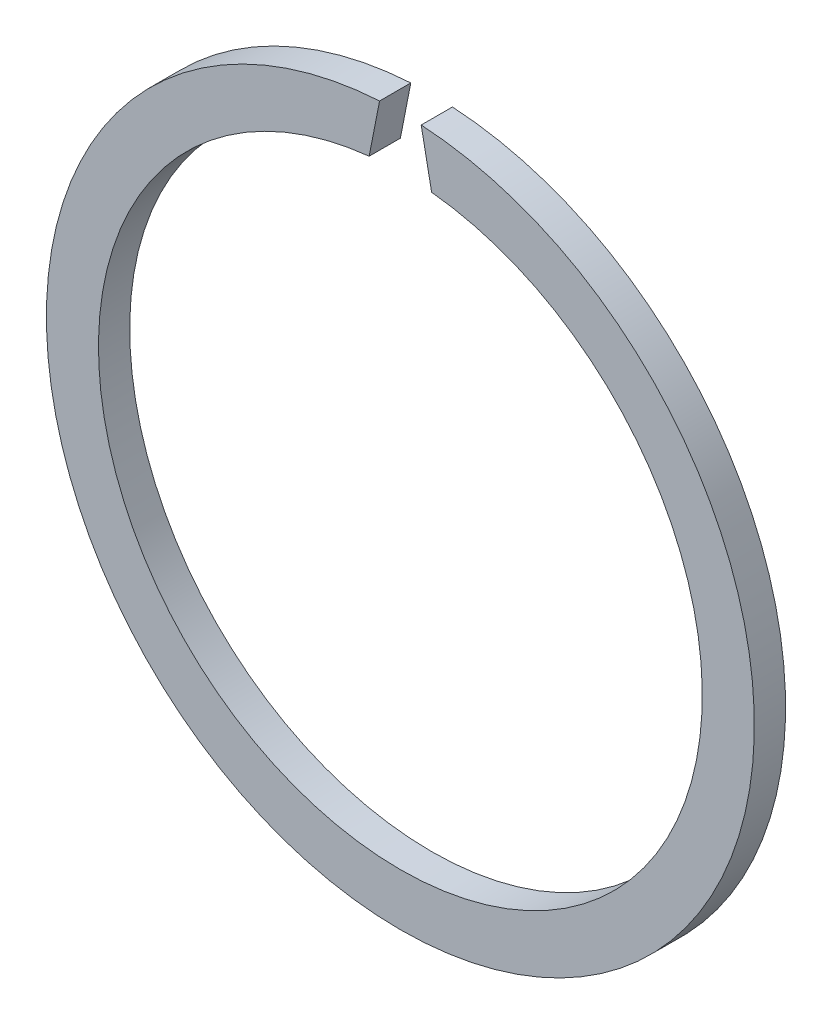
ISO-10303-21;
HEADER;
FILE_DESCRIPTION(('STEP AP214'),'2;1');
FILE_NAME('part.step','',(''),(''),'','','');
FILE_SCHEMA(('AUTOMOTIVE_DESIGN { 1 0 10303 214 1 1 1 1 }'));
ENDSEC;
DATA;
#1=APPLICATION_CONTEXT('core data for automotive mechanical design processes');
#2=APPLICATION_PROTOCOL_DEFINITION('international standard','automotive_design',2000,#1);
#3=PRODUCT_CONTEXT('',#1,'mechanical');
#4=PRODUCT('Part','Part','',(#3));
#5=PRODUCT_RELATED_PRODUCT_CATEGORY('part','',(#4));
#6=PRODUCT_DEFINITION_FORMATION('','',#4);
#7=PRODUCT_DEFINITION_CONTEXT('part definition',#1,'design');
#8=PRODUCT_DEFINITION('design','',#6,#7);
#9=PRODUCT_DEFINITION_SHAPE('','',#8);
#10=(LENGTH_UNIT() NAMED_UNIT(*) SI_UNIT(.MILLI.,.METRE.));
#11=(NAMED_UNIT(*) PLANE_ANGLE_UNIT() SI_UNIT($,.RADIAN.));
#12=(NAMED_UNIT(*) SI_UNIT($,.STERADIAN.) SOLID_ANGLE_UNIT());
#13=UNCERTAINTY_MEASURE_WITH_UNIT(LENGTH_MEASURE(1.E-05),#10,'distance_accuracy_value','');
#14=(GEOMETRIC_REPRESENTATION_CONTEXT(3) GLOBAL_UNCERTAINTY_ASSIGNED_CONTEXT((#13)) GLOBAL_UNIT_ASSIGNED_CONTEXT((#10,
#11,#12)) REPRESENTATION_CONTEXT('',''));
#15=CARTESIAN_POINT('',(0.,0.,0.));
#16=DIRECTION('',(0.,0.,1.));
#17=DIRECTION('',(1.,0.,0.));
#18=AXIS2_PLACEMENT_3D('',#15,#16,#17);
#19=CARTESIAN_POINT('',(0.,0.,1.5));
#20=DIRECTION('',(0.,0.,-1.));
#21=DIRECTION('',(-1.,0.,0.));
#22=AXIS2_PLACEMENT_3D('',#19,#20,#21);
#23=CYLINDRICAL_SURFACE('',#22,14.5);
#24=CARTESIAN_POINT('',(0.,0.,0.));
#25=DIRECTION('',(0.,0.,-1.));
#26=DIRECTION('',(1.,0.,0.));
#27=AXIS2_PLACEMENT_3D('',#24,#25,#26);
#28=CIRCLE('',#27,14.5);
#29=CARTESIAN_POINT('',(1.5,14.422205101856,0.));
#30=VERTEX_POINT('',#29);
#31=CARTESIAN_POINT('',(-1.5,14.422205101856,0.));
#32=VERTEX_POINT('',#31);
#33=EDGE_CURVE('E70',#30,#32,#28,.T.);
#34=ORIENTED_EDGE('',*,*,#33,.T.);
#35=DIRECTION('',(0.,0.,-1.));
#36=VECTOR('',#35,1.);
#37=CARTESIAN_POINT('',(-1.5,14.422205101856,1.5));
#38=LINE('',#37,#36);
#39=CARTESIAN_POINT('',(-1.5,14.422205101856,1.5));
#40=VERTEX_POINT('',#39);
#41=EDGE_CURVE('E11',#40,#32,#38,.T.);
#42=ORIENTED_EDGE('',*,*,#41,.F.);
#43=CARTESIAN_POINT('',(0.,0.,1.5));
#44=DIRECTION('',(0.,0.,-1.));
#45=DIRECTION('',(1.,0.,0.));
#46=AXIS2_PLACEMENT_3D('',#43,#44,#45);
#47=CIRCLE('',#46,14.5);
#48=CARTESIAN_POINT('',(1.5,14.422205101856,1.5));
#49=VERTEX_POINT('',#48);
#50=EDGE_CURVE('E88',#49,#40,#47,.T.);
#51=ORIENTED_EDGE('',*,*,#50,.F.);
#52=DIRECTION('',(0.,0.,-1.));
#53=VECTOR('',#52,1.);
#54=CARTESIAN_POINT('',(1.5,14.422205101856,1.5));
#55=LINE('',#54,#53);
#56=EDGE_CURVE('E82',#49,#30,#55,.T.);
#57=ORIENTED_EDGE('',*,*,#56,.T.);
#58=EDGE_LOOP('',(#34,#42,#51,#57));
#59=FACE_BOUND('',#58,.T.);
#60=ADVANCED_FACE('F26',(#59),#23,.F.);
#61=CARTESIAN_POINT('',(-1.,16.9705627484771,1.5));
#62=DIRECTION('',(-0.981290328220349,0.192533871672491,0.));
#63=DIRECTION('',(-0.192533871672491,-0.981290328220349,0.));
#64=AXIS2_PLACEMENT_3D('',#61,#62,#63);
#65=PLANE('',#64);
#66=DIRECTION('',(0.192533871672491,0.981290328220349,0.));
#67=VECTOR('',#66,1.);
#68=CARTESIAN_POINT('',(-1.,16.9705627484771,0.));
#69=LINE('',#68,#67);
#70=CARTESIAN_POINT('',(-1.,16.9705627484771,0.));
#71=VERTEX_POINT('',#70);
#72=EDGE_CURVE('E66',#32,#71,#69,.T.);
#73=ORIENTED_EDGE('',*,*,#72,.T.);
#74=DIRECTION('',(0.,0.,-1.));
#75=VECTOR('',#74,1.);
#76=CARTESIAN_POINT('',(-1.,16.9705627484771,1.5));
#77=LINE('',#76,#75);
#78=CARTESIAN_POINT('',(-1.,16.9705627484771,1.5));
#79=VERTEX_POINT('',#78);
#80=EDGE_CURVE('E33',#79,#71,#77,.T.);
#81=ORIENTED_EDGE('',*,*,#80,.F.);
#82=DIRECTION('',(0.192533871672491,0.981290328220349,0.));
#83=VECTOR('',#82,1.);
#84=CARTESIAN_POINT('',(-1.,16.9705627484771,1.5));
#85=LINE('',#84,#83);
#86=EDGE_CURVE('E78',#40,#79,#85,.T.);
#87=ORIENTED_EDGE('',*,*,#86,.F.);
#88=ORIENTED_EDGE('',*,*,#41,.T.);
#89=EDGE_LOOP('',(#73,#81,#87,#88));
#90=FACE_BOUND('',#89,.T.);
#91=ADVANCED_FACE('F77',(#90),#65,.F.);
#92=CARTESIAN_POINT('',(0.,0.,1.5));
#93=DIRECTION('',(0.,0.,-1.));
#94=DIRECTION('',(-1.,0.,0.));
#95=AXIS2_PLACEMENT_3D('',#92,#93,#94);
#96=CYLINDRICAL_SURFACE('',#95,17.);
#97=CARTESIAN_POINT('',(0.,0.,0.));
#98=DIRECTION('',(0.,0.,1.));
#99=DIRECTION('',(-1.,0.,0.));
#100=AXIS2_PLACEMENT_3D('',#97,#98,#99);
#101=CIRCLE('',#100,17.);
#102=CARTESIAN_POINT('',(1.,16.9705627484771,0.));
#103=VERTEX_POINT('',#102);
#104=EDGE_CURVE('E71',#71,#103,#101,.T.);
#105=ORIENTED_EDGE('',*,*,#104,.T.);
#106=DIRECTION('',(0.,0.,-1.));
#107=VECTOR('',#106,1.);
#108=CARTESIAN_POINT('',(1.,16.9705627484771,1.5));
#109=LINE('',#108,#107);
#110=CARTESIAN_POINT('',(1.,16.9705627484771,1.5));
#111=VERTEX_POINT('',#110);
#112=EDGE_CURVE('E94',#111,#103,#109,.T.);
#113=ORIENTED_EDGE('',*,*,#112,.F.);
#114=CARTESIAN_POINT('',(0.,0.,1.5));
#115=DIRECTION('',(0.,0.,1.));
#116=DIRECTION('',(-1.,0.,0.));
#117=AXIS2_PLACEMENT_3D('',#114,#115,#116);
#118=CIRCLE('',#117,17.);
#119=EDGE_CURVE('E45',#79,#111,#118,.T.);
#120=ORIENTED_EDGE('',*,*,#119,.F.);
#121=ORIENTED_EDGE('',*,*,#80,.T.);
#122=EDGE_LOOP('',(#105,#113,#120,#121));
#123=FACE_BOUND('',#122,.T.);
#124=ADVANCED_FACE('F97',(#123),#96,.T.);
#125=CARTESIAN_POINT('',(1.5,14.422205101856,1.5));
#126=DIRECTION('',(0.981290328220349,0.192533871672491,0.));
#127=DIRECTION('',(-0.192533871672491,0.981290328220349,0.));
#128=AXIS2_PLACEMENT_3D('',#125,#126,#127);
#129=PLANE('',#128);
#130=DIRECTION('',(0.192533871672491,-0.981290328220349,0.));
#131=VECTOR('',#130,1.);
#132=CARTESIAN_POINT('',(1.5,14.422205101856,0.));
#133=LINE('',#132,#131);
#134=EDGE_CURVE('E86',#103,#30,#133,.T.);
#135=ORIENTED_EDGE('',*,*,#134,.T.);
#136=ORIENTED_EDGE('',*,*,#56,.F.);
#137=DIRECTION('',(0.192533871672491,-0.981290328220349,0.));
#138=VECTOR('',#137,1.);
#139=CARTESIAN_POINT('',(1.5,14.422205101856,1.5));
#140=LINE('',#139,#138);
#141=EDGE_CURVE('E40',#111,#49,#140,.T.);
#142=ORIENTED_EDGE('',*,*,#141,.F.);
#143=ORIENTED_EDGE('',*,*,#112,.T.);
#144=EDGE_LOOP('',(#135,#136,#142,#143));
#145=FACE_BOUND('',#144,.T.);
#146=ADVANCED_FACE('F99',(#145),#129,.F.);
#147=CARTESIAN_POINT('',(0.,0.,1.5));
#148=DIRECTION('',(0.,0.,1.));
#149=DIRECTION('',(1.,0.,0.));
#150=AXIS2_PLACEMENT_3D('',#147,#148,#149);
#151=PLANE('',#150);
#152=ORIENTED_EDGE('',*,*,#50,.T.);
#153=ORIENTED_EDGE('',*,*,#86,.T.);
#154=ORIENTED_EDGE('',*,*,#119,.T.);
#155=ORIENTED_EDGE('',*,*,#141,.T.);
#156=EDGE_LOOP('',(#152,#153,#154,#155));
#157=FACE_BOUND('',#156,.T.);
#158=ADVANCED_FACE('F100',(#157),#151,.T.);
#159=CARTESIAN_POINT('',(0.,0.,0.));
#160=DIRECTION('',(0.,0.,1.));
#161=DIRECTION('',(1.,0.,0.));
#162=AXIS2_PLACEMENT_3D('',#159,#160,#161);
#163=PLANE('',#162);
#164=ORIENTED_EDGE('',*,*,#33,.F.);
#165=ORIENTED_EDGE('',*,*,#134,.F.);
#166=ORIENTED_EDGE('',*,*,#104,.F.);
#167=ORIENTED_EDGE('',*,*,#72,.F.);
#168=EDGE_LOOP('',(#164,#165,#166,#167));
#169=FACE_BOUND('',#168,.T.);
#170=ADVANCED_FACE('F67',(#169),#163,.F.);
#171=CLOSED_SHELL('',(#60,#91,#124,#146,#158,#170));
#172=MANIFOLD_SOLID_BREP('B2',#171);
#173=ADVANCED_BREP_SHAPE_REPRESENTATION('',(#18,#172),#14);
#174=SHAPE_DEFINITION_REPRESENTATION(#9,#173);
ENDSEC;
END-ISO-10303-21;
